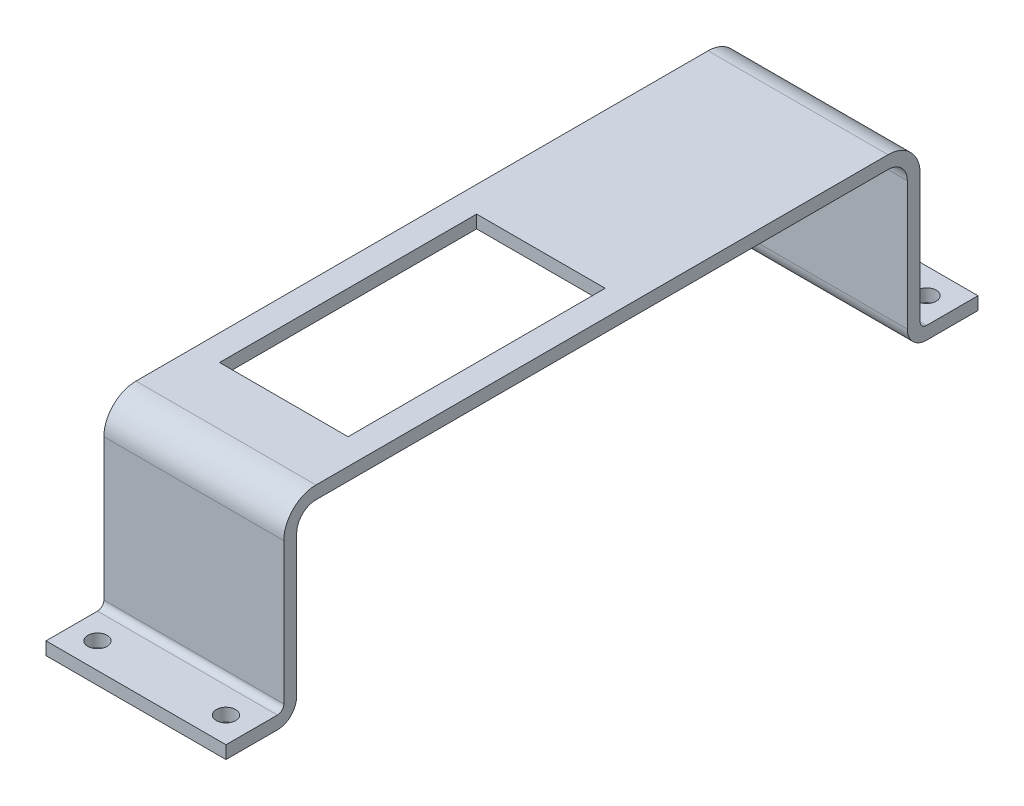
ISO-10303-21;
HEADER;
FILE_DESCRIPTION(('STEP AP214'),'2;1');
FILE_NAME('part.step','',(''),(''),'','','');
FILE_SCHEMA(('AUTOMOTIVE_DESIGN { 1 0 10303 214 1 1 1 1 }'));
ENDSEC;
DATA;
#1=APPLICATION_CONTEXT('core data for automotive mechanical design processes');
#2=APPLICATION_PROTOCOL_DEFINITION('international standard','automotive_design',2000,#1);
#3=PRODUCT_CONTEXT('',#1,'mechanical');
#4=PRODUCT('Part','Part','',(#3));
#5=PRODUCT_RELATED_PRODUCT_CATEGORY('part','',(#4));
#6=PRODUCT_DEFINITION_FORMATION('','',#4);
#7=PRODUCT_DEFINITION_CONTEXT('part definition',#1,'design');
#8=PRODUCT_DEFINITION('design','',#6,#7);
#9=PRODUCT_DEFINITION_SHAPE('','',#8);
#10=(LENGTH_UNIT() NAMED_UNIT(*) SI_UNIT(.MILLI.,.METRE.));
#11=(NAMED_UNIT(*) PLANE_ANGLE_UNIT() SI_UNIT($,.RADIAN.));
#12=(NAMED_UNIT(*) SI_UNIT($,.STERADIAN.) SOLID_ANGLE_UNIT());
#13=UNCERTAINTY_MEASURE_WITH_UNIT(LENGTH_MEASURE(1.E-05),#10,'distance_accuracy_value','');
#14=(GEOMETRIC_REPRESENTATION_CONTEXT(3) GLOBAL_UNCERTAINTY_ASSIGNED_CONTEXT((#13)) GLOBAL_UNIT_ASSIGNED_CONTEXT((#10,
#11,#12)) REPRESENTATION_CONTEXT('',''));
#15=CARTESIAN_POINT('',(0.,0.,0.));
#16=DIRECTION('',(0.,0.,1.));
#17=DIRECTION('',(1.,0.,0.));
#18=AXIS2_PLACEMENT_3D('',#15,#16,#17);
#19=CARTESIAN_POINT('',(14.,2.,-11.));
#20=DIRECTION('',(0.,0.,1.));
#21=DIRECTION('',(1.,0.,0.));
#22=AXIS2_PLACEMENT_3D('',#19,#20,#21);
#23=PLANE('',#22);
#24=DIRECTION('',(0.,1.,0.));
#25=VECTOR('',#24,1.);
#26=CARTESIAN_POINT('',(-14.,2.,-11.));
#27=LINE('',#26,#25);
#28=CARTESIAN_POINT('',(-14.,0.,-11.));
#29=VERTEX_POINT('',#28);
#30=CARTESIAN_POINT('',(-14.,2.,-11.));
#31=VERTEX_POINT('',#30);
#32=EDGE_CURVE('E220',#29,#31,#27,.T.);
#33=ORIENTED_EDGE('',*,*,#32,.T.);
#34=DIRECTION('',(-1.,0.,0.));
#35=VECTOR('',#34,1.);
#36=CARTESIAN_POINT('',(14.,2.,-11.));
#37=LINE('',#36,#35);
#38=CARTESIAN_POINT('',(14.,2.,-11.));
#39=VERTEX_POINT('',#38);
#40=EDGE_CURVE('E361',#39,#31,#37,.T.);
#41=ORIENTED_EDGE('',*,*,#40,.F.);
#42=DIRECTION('',(0.,1.,0.));
#43=VECTOR('',#42,1.);
#44=CARTESIAN_POINT('',(14.,2.,-11.));
#45=LINE('',#44,#43);
#46=CARTESIAN_POINT('',(14.,0.,-11.));
#47=VERTEX_POINT('',#46);
#48=EDGE_CURVE('E223',#47,#39,#45,.T.);
#49=ORIENTED_EDGE('',*,*,#48,.F.);
#50=DIRECTION('',(-1.,0.,0.));
#51=VECTOR('',#50,1.);
#52=CARTESIAN_POINT('',(14.,0.,-11.));
#53=LINE('',#52,#51);
#54=EDGE_CURVE('E265',#47,#29,#53,.T.);
#55=ORIENTED_EDGE('',*,*,#54,.T.);
#56=EDGE_LOOP('',(#33,#41,#49,#55));
#57=FACE_BOUND('',#56,.T.);
#58=ADVANCED_FACE('F32',(#57),#23,.F.);
#59=CARTESIAN_POINT('',(14.,2.,-3.));
#60=DIRECTION('',(0.,-1.,0.));
#61=DIRECTION('',(0.,0.,-1.));
#62=AXIS2_PLACEMENT_3D('',#59,#60,#61);
#63=PLANE('',#62);
#64=CARTESIAN_POINT('',(-10.,2.,-7.));
#65=DIRECTION('',(0.,1.,0.));
#66=DIRECTION('',(0.,0.,1.));
#67=AXIS2_PLACEMENT_3D('',#64,#65,#66);
#68=CIRCLE('',#67,1.5);
#69=CARTESIAN_POINT('',(-10.,2.,-5.5));
#70=VERTEX_POINT('',#69);
#71=EDGE_CURVE('E382',#70,#70,#68,.T.);
#72=ORIENTED_EDGE('',*,*,#71,.F.);
#73=EDGE_LOOP('',(#72));
#74=FACE_BOUND('',#73,.T.);
#75=CARTESIAN_POINT('',(10.,2.,-7.));
#76=DIRECTION('',(0.,1.,0.));
#77=DIRECTION('',(0.,0.,1.));
#78=AXIS2_PLACEMENT_3D('',#75,#76,#77);
#79=CIRCLE('',#78,1.5);
#80=CARTESIAN_POINT('',(10.,2.,-5.5));
#81=VERTEX_POINT('',#80);
#82=EDGE_CURVE('E371',#81,#81,#79,.T.);
#83=ORIENTED_EDGE('',*,*,#82,.F.);
#84=EDGE_LOOP('',(#83));
#85=FACE_BOUND('',#84,.T.);
#86=DIRECTION('',(0.,0.,1.));
#87=VECTOR('',#86,1.);
#88=CARTESIAN_POINT('',(-14.,2.,-3.));
#89=LINE('',#88,#87);
#90=CARTESIAN_POINT('',(-14.,2.,-3.));
#91=VERTEX_POINT('',#90);
#92=EDGE_CURVE('E268',#31,#91,#89,.T.);
#93=ORIENTED_EDGE('',*,*,#92,.T.);
#94=DIRECTION('',(-1.,0.,0.));
#95=VECTOR('',#94,1.);
#96=CARTESIAN_POINT('',(14.,2.,-3.));
#97=LINE('',#96,#95);
#98=CARTESIAN_POINT('',(14.,2.,-3.));
#99=VERTEX_POINT('',#98);
#100=EDGE_CURVE('E358',#99,#91,#97,.T.);
#101=ORIENTED_EDGE('',*,*,#100,.F.);
#102=DIRECTION('',(0.,0.,1.));
#103=VECTOR('',#102,1.);
#104=CARTESIAN_POINT('',(14.,2.,-3.));
#105=LINE('',#104,#103);
#106=EDGE_CURVE('E226',#39,#99,#105,.T.);
#107=ORIENTED_EDGE('',*,*,#106,.F.);
#108=ORIENTED_EDGE('',*,*,#40,.T.);
#109=EDGE_LOOP('',(#93,#101,#107,#108));
#110=FACE_BOUND('',#109,.T.);
#111=ADVANCED_FACE('F464',(#74,#85,#110),#63,.F.);
#112=CARTESIAN_POINT('',(14.,3.,-3.));
#113=DIRECTION('',(-1.,0.,0.));
#114=DIRECTION('',(0.,0.,1.));
#115=AXIS2_PLACEMENT_3D('',#112,#113,#114);
#116=CYLINDRICAL_SURFACE('',#115,1.);
#117=CARTESIAN_POINT('',(-14.,3.,-3.));
#118=DIRECTION('',(-1.,0.,0.));
#119=DIRECTION('',(0.,0.,-1.));
#120=AXIS2_PLACEMENT_3D('',#117,#118,#119);
#121=CIRCLE('',#120,1.);
#122=CARTESIAN_POINT('',(-14.,3.,-2.));
#123=VERTEX_POINT('',#122);
#124=EDGE_CURVE('E270',#91,#123,#121,.T.);
#125=ORIENTED_EDGE('',*,*,#124,.T.);
#126=DIRECTION('',(-1.,0.,0.));
#127=VECTOR('',#126,1.);
#128=CARTESIAN_POINT('',(14.,3.,-2.));
#129=LINE('',#128,#127);
#130=CARTESIAN_POINT('',(14.,3.,-2.));
#131=VERTEX_POINT('',#130);
#132=EDGE_CURVE('E355',#131,#123,#129,.T.);
#133=ORIENTED_EDGE('',*,*,#132,.F.);
#134=CARTESIAN_POINT('',(14.,3.,-3.));
#135=DIRECTION('',(-1.,0.,0.));
#136=DIRECTION('',(0.,0.,-1.));
#137=AXIS2_PLACEMENT_3D('',#134,#135,#136);
#138=CIRCLE('',#137,1.);
#139=EDGE_CURVE('E229',#99,#131,#138,.T.);
#140=ORIENTED_EDGE('',*,*,#139,.F.);
#141=ORIENTED_EDGE('',*,*,#100,.T.);
#142=EDGE_LOOP('',(#125,#133,#140,#141));
#143=FACE_BOUND('',#142,.T.);
#144=ADVANCED_FACE('F459',(#143),#116,.F.);
#145=CARTESIAN_POINT('',(14.,23.,-2.));
#146=DIRECTION('',(0.,0.,1.));
#147=DIRECTION('',(0.,-1.,0.));
#148=AXIS2_PLACEMENT_3D('',#145,#146,#147);
#149=PLANE('',#148);
#150=DIRECTION('',(0.,1.,0.));
#151=VECTOR('',#150,1.);
#152=CARTESIAN_POINT('',(-14.,23.,-2.));
#153=LINE('',#152,#151);
#154=CARTESIAN_POINT('',(-14.,23.,-2.));
#155=VERTEX_POINT('',#154);
#156=EDGE_CURVE('E272',#123,#155,#153,.T.);
#157=ORIENTED_EDGE('',*,*,#156,.T.);
#158=DIRECTION('',(-1.,0.,0.));
#159=VECTOR('',#158,1.);
#160=CARTESIAN_POINT('',(14.,23.,-2.));
#161=LINE('',#160,#159);
#162=CARTESIAN_POINT('',(14.,23.,-2.));
#163=VERTEX_POINT('',#162);
#164=EDGE_CURVE('E352',#163,#155,#161,.T.);
#165=ORIENTED_EDGE('',*,*,#164,.F.);
#166=DIRECTION('',(0.,1.,0.));
#167=VECTOR('',#166,1.);
#168=CARTESIAN_POINT('',(14.,23.,-2.));
#169=LINE('',#168,#167);
#170=EDGE_CURVE('E231',#131,#163,#169,.T.);
#171=ORIENTED_EDGE('',*,*,#170,.F.);
#172=ORIENTED_EDGE('',*,*,#132,.T.);
#173=EDGE_LOOP('',(#157,#165,#171,#172));
#174=FACE_BOUND('',#173,.T.);
#175=ADVANCED_FACE('F455',(#174),#149,.F.);
#176=CARTESIAN_POINT('',(14.,23.,3.));
#177=DIRECTION('',(-1.,0.,0.));
#178=DIRECTION('',(0.,0.,1.));
#179=AXIS2_PLACEMENT_3D('',#176,#177,#178);
#180=CYLINDRICAL_SURFACE('',#179,5.);
#181=CARTESIAN_POINT('',(-14.,23.,3.));
#182=DIRECTION('',(1.,0.,0.));
#183=DIRECTION('',(0.,0.,1.));
#184=AXIS2_PLACEMENT_3D('',#181,#182,#183);
#185=CIRCLE('',#184,5.);
#186=CARTESIAN_POINT('',(-14.,28.,3.));
#187=VERTEX_POINT('',#186);
#188=EDGE_CURVE('E274',#155,#187,#185,.T.);
#189=ORIENTED_EDGE('',*,*,#188,.T.);
#190=DIRECTION('',(-1.,0.,0.));
#191=VECTOR('',#190,1.);
#192=CARTESIAN_POINT('',(14.,28.,3.));
#193=LINE('',#192,#191);
#194=CARTESIAN_POINT('',(14.,28.,3.));
#195=VERTEX_POINT('',#194);
#196=EDGE_CURVE('E349',#195,#187,#193,.T.);
#197=ORIENTED_EDGE('',*,*,#196,.F.);
#198=CARTESIAN_POINT('',(14.,23.,3.));
#199=DIRECTION('',(1.,0.,0.));
#200=DIRECTION('',(0.,0.,1.));
#201=AXIS2_PLACEMENT_3D('',#198,#199,#200);
#202=CIRCLE('',#201,5.);
#203=EDGE_CURVE('E233',#163,#195,#202,.T.);
#204=ORIENTED_EDGE('',*,*,#203,.F.);
#205=ORIENTED_EDGE('',*,*,#164,.T.);
#206=EDGE_LOOP('',(#189,#197,#204,#205));
#207=FACE_BOUND('',#206,.T.);
#208=ADVANCED_FACE('F450',(#207),#180,.T.);
#209=CARTESIAN_POINT('',(14.,28.,3.));
#210=DIRECTION('',(0.,-1.,0.));
#211=DIRECTION('',(0.,0.,-1.));
#212=AXIS2_PLACEMENT_3D('',#209,#210,#211);
#213=PLANE('',#212);
#214=DIRECTION('',(1.,0.,0.));
#215=VECTOR('',#214,1.);
#216=CARTESIAN_POINT('',(-9.99999999999999,28.,83.));
#217=LINE('',#216,#215);
#218=CARTESIAN_POINT('',(-9.99999999999999,28.,83.));
#219=VERTEX_POINT('',#218);
#220=CARTESIAN_POINT('',(10.,28.,83.));
#221=VERTEX_POINT('',#220);
#222=EDGE_CURVE('E206',#219,#221,#217,.T.);
#223=ORIENTED_EDGE('',*,*,#222,.F.);
#224=DIRECTION('',(0.,0.,1.));
#225=VECTOR('',#224,1.);
#226=CARTESIAN_POINT('',(-9.99999999999999,28.,43.));
#227=LINE('',#226,#225);
#228=CARTESIAN_POINT('',(-9.99999999999999,28.,43.));
#229=VERTEX_POINT('',#228);
#230=EDGE_CURVE('E48',#229,#219,#227,.T.);
#231=ORIENTED_EDGE('',*,*,#230,.F.);
#232=DIRECTION('',(-1.,0.,0.));
#233=VECTOR('',#232,1.);
#234=CARTESIAN_POINT('',(-9.99999999999999,28.,43.));
#235=LINE('',#234,#233);
#236=CARTESIAN_POINT('',(10.,28.,43.));
#237=VERTEX_POINT('',#236);
#238=EDGE_CURVE('E213',#237,#229,#235,.T.);
#239=ORIENTED_EDGE('',*,*,#238,.F.);
#240=DIRECTION('',(0.,0.,-1.));
#241=VECTOR('',#240,1.);
#242=CARTESIAN_POINT('',(10.,28.,43.));
#243=LINE('',#242,#241);
#244=EDGE_CURVE('E197',#221,#237,#243,.T.);
#245=ORIENTED_EDGE('',*,*,#244,.F.);
#246=EDGE_LOOP('',(#223,#231,#239,#245));
#247=FACE_BOUND('',#246,.T.);
#248=DIRECTION('',(0.,0.,1.));
#249=VECTOR('',#248,1.);
#250=CARTESIAN_POINT('',(-14.,28.,3.));
#251=LINE('',#250,#249);
#252=CARTESIAN_POINT('',(-14.,28.,92.));
#253=VERTEX_POINT('',#252);
#254=EDGE_CURVE('E276',#187,#253,#251,.T.);
#255=ORIENTED_EDGE('',*,*,#254,.T.);
#256=DIRECTION('',(-1.,0.,0.));
#257=VECTOR('',#256,1.);
#258=CARTESIAN_POINT('',(14.,28.,92.));
#259=LINE('',#258,#257);
#260=CARTESIAN_POINT('',(14.,28.,92.));
#261=VERTEX_POINT('',#260);
#262=EDGE_CURVE('E346',#261,#253,#259,.T.);
#263=ORIENTED_EDGE('',*,*,#262,.F.);
#264=DIRECTION('',(0.,0.,1.));
#265=VECTOR('',#264,1.);
#266=CARTESIAN_POINT('',(14.,28.,3.));
#267=LINE('',#266,#265);
#268=EDGE_CURVE('E235',#195,#261,#267,.T.);
#269=ORIENTED_EDGE('',*,*,#268,.F.);
#270=ORIENTED_EDGE('',*,*,#196,.T.);
#271=EDGE_LOOP('',(#255,#263,#269,#270));
#272=FACE_BOUND('',#271,.T.);
#273=ADVANCED_FACE('F210',(#247,#272),#213,.F.);
#274=CARTESIAN_POINT('',(14.,23.,92.));
#275=DIRECTION('',(-1.,0.,0.));
#276=DIRECTION('',(0.,0.,1.));
#277=AXIS2_PLACEMENT_3D('',#274,#275,#276);
#278=CYLINDRICAL_SURFACE('',#277,5.);
#279=CARTESIAN_POINT('',(-14.,23.,92.));
#280=DIRECTION('',(1.,0.,0.));
#281=DIRECTION('',(0.,0.,-1.));
#282=AXIS2_PLACEMENT_3D('',#279,#280,#281);
#283=CIRCLE('',#282,5.);
#284=CARTESIAN_POINT('',(-14.,23.,97.));
#285=VERTEX_POINT('',#284);
#286=EDGE_CURVE('E278',#253,#285,#283,.T.);
#287=ORIENTED_EDGE('',*,*,#286,.T.);
#288=DIRECTION('',(-1.,0.,0.));
#289=VECTOR('',#288,1.);
#290=CARTESIAN_POINT('',(14.,23.,97.));
#291=LINE('',#290,#289);
#292=CARTESIAN_POINT('',(14.,23.,97.));
#293=VERTEX_POINT('',#292);
#294=EDGE_CURVE('E343',#293,#285,#291,.T.);
#295=ORIENTED_EDGE('',*,*,#294,.F.);
#296=CARTESIAN_POINT('',(14.,23.,92.));
#297=DIRECTION('',(1.,0.,0.));
#298=DIRECTION('',(0.,0.,-1.));
#299=AXIS2_PLACEMENT_3D('',#296,#297,#298);
#300=CIRCLE('',#299,5.);
#301=EDGE_CURVE('E237',#261,#293,#300,.T.);
#302=ORIENTED_EDGE('',*,*,#301,.F.);
#303=ORIENTED_EDGE('',*,*,#262,.T.);
#304=EDGE_LOOP('',(#287,#295,#302,#303));
#305=FACE_BOUND('',#304,.T.);
#306=ADVANCED_FACE('F442',(#305),#278,.T.);
#307=CARTESIAN_POINT('',(14.,23.,97.));
#308=DIRECTION('',(0.,0.,-1.));
#309=DIRECTION('',(-1.,0.,0.));
#310=AXIS2_PLACEMENT_3D('',#307,#308,#309);
#311=PLANE('',#310);
#312=DIRECTION('',(0.,-1.,0.));
#313=VECTOR('',#312,1.);
#314=CARTESIAN_POINT('',(-14.,23.,97.));
#315=LINE('',#314,#313);
#316=CARTESIAN_POINT('',(-14.,0.999999999999994,97.));
#317=VERTEX_POINT('',#316);
#318=EDGE_CURVE('E280',#285,#317,#315,.T.);
#319=ORIENTED_EDGE('',*,*,#318,.T.);
#320=DIRECTION('',(-1.,0.,0.));
#321=VECTOR('',#320,1.);
#322=CARTESIAN_POINT('',(14.,0.999999999999994,97.));
#323=LINE('',#322,#321);
#324=CARTESIAN_POINT('',(14.,0.999999999999994,97.));
#325=VERTEX_POINT('',#324);
#326=EDGE_CURVE('E340',#325,#317,#323,.T.);
#327=ORIENTED_EDGE('',*,*,#326,.F.);
#328=DIRECTION('',(0.,-1.,0.));
#329=VECTOR('',#328,1.);
#330=CARTESIAN_POINT('',(14.,23.,97.));
#331=LINE('',#330,#329);
#332=EDGE_CURVE('E239',#293,#325,#331,.T.);
#333=ORIENTED_EDGE('',*,*,#332,.F.);
#334=ORIENTED_EDGE('',*,*,#294,.T.);
#335=EDGE_LOOP('',(#319,#327,#333,#334));
#336=FACE_BOUND('',#335,.T.);
#337=ADVANCED_FACE('F438',(#336),#311,.F.);
#338=CARTESIAN_POINT('',(14.,0.999999999999995,98.));
#339=DIRECTION('',(-1.,0.,0.));
#340=DIRECTION('',(0.,0.,1.));
#341=AXIS2_PLACEMENT_3D('',#338,#339,#340);
#342=CYLINDRICAL_SURFACE('',#341,1.);
#343=CARTESIAN_POINT('',(-14.,0.999999999999995,98.));
#344=DIRECTION('',(-1.,0.,0.));
#345=DIRECTION('',(0.,0.,1.));
#346=AXIS2_PLACEMENT_3D('',#343,#344,#345);
#347=CIRCLE('',#346,1.);
#348=CARTESIAN_POINT('',(-14.,0.,98.));
#349=VERTEX_POINT('',#348);
#350=EDGE_CURVE('E282',#317,#349,#347,.T.);
#351=ORIENTED_EDGE('',*,*,#350,.T.);
#352=DIRECTION('',(-1.,0.,0.));
#353=VECTOR('',#352,1.);
#354=CARTESIAN_POINT('',(14.,0.,98.));
#355=LINE('',#354,#353);
#356=CARTESIAN_POINT('',(14.,0.,98.));
#357=VERTEX_POINT('',#356);
#358=EDGE_CURVE('E337',#357,#349,#355,.T.);
#359=ORIENTED_EDGE('',*,*,#358,.F.);
#360=CARTESIAN_POINT('',(14.,0.999999999999995,98.));
#361=DIRECTION('',(-1.,0.,0.));
#362=DIRECTION('',(0.,0.,1.));
#363=AXIS2_PLACEMENT_3D('',#360,#361,#362);
#364=CIRCLE('',#363,1.);
#365=EDGE_CURVE('E241',#325,#357,#364,.T.);
#366=ORIENTED_EDGE('',*,*,#365,.F.);
#367=ORIENTED_EDGE('',*,*,#326,.T.);
#368=EDGE_LOOP('',(#351,#359,#366,#367));
#369=FACE_BOUND('',#368,.T.);
#370=ADVANCED_FACE('F400',(#369),#342,.F.);
#371=CARTESIAN_POINT('',(14.,0.,98.));
#372=DIRECTION('',(0.,-1.,0.));
#373=DIRECTION('',(0.,0.,-1.));
#374=AXIS2_PLACEMENT_3D('',#371,#372,#373);
#375=PLANE('',#374);
#376=CARTESIAN_POINT('',(-10.,0.,102.));
#377=DIRECTION('',(0.,1.,0.));
#378=DIRECTION('',(0.,0.,1.));
#379=AXIS2_PLACEMENT_3D('',#376,#377,#378);
#380=CIRCLE('',#379,1.5);
#381=CARTESIAN_POINT('',(-10.,0.,103.5));
#382=VERTEX_POINT('',#381);
#383=EDGE_CURVE('E370',#382,#382,#380,.T.);
#384=ORIENTED_EDGE('',*,*,#383,.F.);
#385=EDGE_LOOP('',(#384));
#386=FACE_BOUND('',#385,.T.);
#387=CARTESIAN_POINT('',(10.,0.,102.));
#388=DIRECTION('',(0.,1.,0.));
#389=DIRECTION('',(0.,0.,1.));
#390=AXIS2_PLACEMENT_3D('',#387,#388,#389);
#391=CIRCLE('',#390,1.5);
#392=CARTESIAN_POINT('',(10.,0.,103.5));
#393=VERTEX_POINT('',#392);
#394=EDGE_CURVE('E386',#393,#393,#391,.T.);
#395=ORIENTED_EDGE('',*,*,#394,.F.);
#396=EDGE_LOOP('',(#395));
#397=FACE_BOUND('',#396,.T.);
#398=DIRECTION('',(0.,0.,1.));
#399=VECTOR('',#398,1.);
#400=CARTESIAN_POINT('',(-14.,0.,98.));
#401=LINE('',#400,#399);
#402=CARTESIAN_POINT('',(-14.,0.,106.));
#403=VERTEX_POINT('',#402);
#404=EDGE_CURVE('E284',#349,#403,#401,.T.);
#405=ORIENTED_EDGE('',*,*,#404,.T.);
#406=DIRECTION('',(-1.,0.,0.));
#407=VECTOR('',#406,1.);
#408=CARTESIAN_POINT('',(14.,0.,106.));
#409=LINE('',#408,#407);
#410=CARTESIAN_POINT('',(14.,0.,106.));
#411=VERTEX_POINT('',#410);
#412=EDGE_CURVE('E334',#411,#403,#409,.T.);
#413=ORIENTED_EDGE('',*,*,#412,.F.);
#414=DIRECTION('',(0.,0.,1.));
#415=VECTOR('',#414,1.);
#416=CARTESIAN_POINT('',(14.,0.,98.));
#417=LINE('',#416,#415);
#418=EDGE_CURVE('E243',#357,#411,#417,.T.);
#419=ORIENTED_EDGE('',*,*,#418,.F.);
#420=ORIENTED_EDGE('',*,*,#358,.T.);
#421=EDGE_LOOP('',(#405,#413,#419,#420));
#422=FACE_BOUND('',#421,.T.);
#423=ADVANCED_FACE('F396',(#386,#397,#422),#375,.F.);
#424=CARTESIAN_POINT('',(14.,0.,106.));
#425=DIRECTION('',(0.,0.,-1.));
#426=DIRECTION('',(-1.,0.,0.));
#427=AXIS2_PLACEMENT_3D('',#424,#425,#426);
#428=PLANE('',#427);
#429=DIRECTION('',(0.,-1.,0.));
#430=VECTOR('',#429,1.);
#431=CARTESIAN_POINT('',(-14.,0.,106.));
#432=LINE('',#431,#430);
#433=CARTESIAN_POINT('',(-14.,-2.00000000000001,106.));
#434=VERTEX_POINT('',#433);
#435=EDGE_CURVE('E286',#403,#434,#432,.T.);
#436=ORIENTED_EDGE('',*,*,#435,.T.);
#437=DIRECTION('',(-1.,0.,0.));
#438=VECTOR('',#437,1.);
#439=CARTESIAN_POINT('',(14.,-2.00000000000001,106.));
#440=LINE('',#439,#438);
#441=CARTESIAN_POINT('',(14.,-2.00000000000001,106.));
#442=VERTEX_POINT('',#441);
#443=EDGE_CURVE('E331',#442,#434,#440,.T.);
#444=ORIENTED_EDGE('',*,*,#443,.F.);
#445=DIRECTION('',(0.,-1.,0.));
#446=VECTOR('',#445,1.);
#447=CARTESIAN_POINT('',(14.,0.,106.));
#448=LINE('',#447,#446);
#449=EDGE_CURVE('E245',#411,#442,#448,.T.);
#450=ORIENTED_EDGE('',*,*,#449,.F.);
#451=ORIENTED_EDGE('',*,*,#412,.T.);
#452=EDGE_LOOP('',(#436,#444,#450,#451));
#453=FACE_BOUND('',#452,.T.);
#454=ADVANCED_FACE('F399',(#453),#428,.F.);
#455=CARTESIAN_POINT('',(14.,-2.00000000000001,98.));
#456=DIRECTION('',(0.,1.,0.));
#457=DIRECTION('',(0.,0.,1.));
#458=AXIS2_PLACEMENT_3D('',#455,#456,#457);
#459=PLANE('',#458);
#460=CARTESIAN_POINT('',(-10.,-2.00000000000002,102.));
#461=DIRECTION('',(0.,1.,0.));
#462=DIRECTION('',(0.,0.,1.));
#463=AXIS2_PLACEMENT_3D('',#460,#461,#462);
#464=CIRCLE('',#463,1.5);
#465=CARTESIAN_POINT('',(-10.,-2.00000000000002,103.5));
#466=VERTEX_POINT('',#465);
#467=EDGE_CURVE('E375',#466,#466,#464,.T.);
#468=ORIENTED_EDGE('',*,*,#467,.T.);
#469=EDGE_LOOP('',(#468));
#470=FACE_BOUND('',#469,.T.);
#471=CARTESIAN_POINT('',(10.,-2.00000000000002,102.));
#472=DIRECTION('',(0.,1.,0.));
#473=DIRECTION('',(0.,0.,1.));
#474=AXIS2_PLACEMENT_3D('',#471,#472,#473);
#475=CIRCLE('',#474,1.5);
#476=CARTESIAN_POINT('',(10.,-2.00000000000002,103.5));
#477=VERTEX_POINT('',#476);
#478=EDGE_CURVE('E388',#477,#477,#475,.T.);
#479=ORIENTED_EDGE('',*,*,#478,.T.);
#480=EDGE_LOOP('',(#479));
#481=FACE_BOUND('',#480,.T.);
#482=DIRECTION('',(0.,0.,-1.));
#483=VECTOR('',#482,1.);
#484=CARTESIAN_POINT('',(-14.,-2.00000000000001,98.));
#485=LINE('',#484,#483);
#486=CARTESIAN_POINT('',(-14.,-2.00000000000001,98.));
#487=VERTEX_POINT('',#486);
#488=EDGE_CURVE('E288',#434,#487,#485,.T.);
#489=ORIENTED_EDGE('',*,*,#488,.T.);
#490=DIRECTION('',(-1.,0.,0.));
#491=VECTOR('',#490,1.);
#492=CARTESIAN_POINT('',(14.,-2.00000000000001,98.));
#493=LINE('',#492,#491);
#494=CARTESIAN_POINT('',(14.,-2.00000000000001,98.));
#495=VERTEX_POINT('',#494);
#496=EDGE_CURVE('E328',#495,#487,#493,.T.);
#497=ORIENTED_EDGE('',*,*,#496,.F.);
#498=DIRECTION('',(0.,0.,-1.));
#499=VECTOR('',#498,1.);
#500=CARTESIAN_POINT('',(14.,-2.00000000000001,98.));
#501=LINE('',#500,#499);
#502=EDGE_CURVE('E247',#442,#495,#501,.T.);
#503=ORIENTED_EDGE('',*,*,#502,.F.);
#504=ORIENTED_EDGE('',*,*,#443,.T.);
#505=EDGE_LOOP('',(#489,#497,#503,#504));
#506=FACE_BOUND('',#505,.T.);
#507=ADVANCED_FACE('F420',(#470,#481,#506),#459,.F.);
#508=CARTESIAN_POINT('',(14.,0.999999999999995,98.));
#509=DIRECTION('',(-1.,0.,0.));
#510=DIRECTION('',(0.,0.,1.));
#511=AXIS2_PLACEMENT_3D('',#508,#509,#510);
#512=CYLINDRICAL_SURFACE('',#511,3.);
#513=CARTESIAN_POINT('',(-14.,0.999999999999995,98.));
#514=DIRECTION('',(1.,0.,0.));
#515=DIRECTION('',(0.,0.,1.));
#516=AXIS2_PLACEMENT_3D('',#513,#514,#515);
#517=CIRCLE('',#516,3.);
#518=CARTESIAN_POINT('',(-14.,0.999999999999995,95.));
#519=VERTEX_POINT('',#518);
#520=EDGE_CURVE('E290',#487,#519,#517,.T.);
#521=ORIENTED_EDGE('',*,*,#520,.T.);
#522=DIRECTION('',(-1.,0.,0.));
#523=VECTOR('',#522,1.);
#524=CARTESIAN_POINT('',(14.,0.999999999999995,95.));
#525=LINE('',#524,#523);
#526=CARTESIAN_POINT('',(14.,0.999999999999995,95.));
#527=VERTEX_POINT('',#526);
#528=EDGE_CURVE('E325',#527,#519,#525,.T.);
#529=ORIENTED_EDGE('',*,*,#528,.F.);
#530=CARTESIAN_POINT('',(14.,0.999999999999995,98.));
#531=DIRECTION('',(1.,0.,0.));
#532=DIRECTION('',(0.,0.,1.));
#533=AXIS2_PLACEMENT_3D('',#530,#531,#532);
#534=CIRCLE('',#533,3.);
#535=EDGE_CURVE('E249',#495,#527,#534,.T.);
#536=ORIENTED_EDGE('',*,*,#535,.F.);
#537=ORIENTED_EDGE('',*,*,#496,.T.);
#538=EDGE_LOOP('',(#521,#529,#536,#537));
#539=FACE_BOUND('',#538,.T.);
#540=ADVANCED_FACE('F424',(#539),#512,.T.);
#541=CARTESIAN_POINT('',(14.,23.,95.));
#542=DIRECTION('',(0.,0.,1.));
#543=DIRECTION('',(1.,0.,0.));
#544=AXIS2_PLACEMENT_3D('',#541,#542,#543);
#545=PLANE('',#544);
#546=DIRECTION('',(0.,1.,0.));
#547=VECTOR('',#546,1.);
#548=CARTESIAN_POINT('',(-14.,23.,95.));
#549=LINE('',#548,#547);
#550=CARTESIAN_POINT('',(-14.,23.,95.));
#551=VERTEX_POINT('',#550);
#552=EDGE_CURVE('E292',#519,#551,#549,.T.);
#553=ORIENTED_EDGE('',*,*,#552,.T.);
#554=DIRECTION('',(-1.,0.,0.));
#555=VECTOR('',#554,1.);
#556=CARTESIAN_POINT('',(14.,23.,95.));
#557=LINE('',#556,#555);
#558=CARTESIAN_POINT('',(14.,23.,95.));
#559=VERTEX_POINT('',#558);
#560=EDGE_CURVE('E322',#559,#551,#557,.T.);
#561=ORIENTED_EDGE('',*,*,#560,.F.);
#562=DIRECTION('',(0.,1.,0.));
#563=VECTOR('',#562,1.);
#564=CARTESIAN_POINT('',(14.,23.,95.));
#565=LINE('',#564,#563);
#566=EDGE_CURVE('E251',#527,#559,#565,.T.);
#567=ORIENTED_EDGE('',*,*,#566,.F.);
#568=ORIENTED_EDGE('',*,*,#528,.T.);
#569=EDGE_LOOP('',(#553,#561,#567,#568));
#570=FACE_BOUND('',#569,.T.);
#571=ADVANCED_FACE('F497',(#570),#545,.F.);
#572=CARTESIAN_POINT('',(14.,23.,92.));
#573=DIRECTION('',(-1.,0.,0.));
#574=DIRECTION('',(0.,0.,1.));
#575=AXIS2_PLACEMENT_3D('',#572,#573,#574);
#576=CYLINDRICAL_SURFACE('',#575,3.);
#577=CARTESIAN_POINT('',(-14.,23.,92.));
#578=DIRECTION('',(-1.,0.,0.));
#579=DIRECTION('',(0.,0.,-1.));
#580=AXIS2_PLACEMENT_3D('',#577,#578,#579);
#581=CIRCLE('',#580,3.);
#582=CARTESIAN_POINT('',(-14.,26.,92.));
#583=VERTEX_POINT('',#582);
#584=EDGE_CURVE('E294',#551,#583,#581,.T.);
#585=ORIENTED_EDGE('',*,*,#584,.T.);
#586=DIRECTION('',(-1.,0.,0.));
#587=VECTOR('',#586,1.);
#588=CARTESIAN_POINT('',(14.,26.,92.));
#589=LINE('',#588,#587);
#590=CARTESIAN_POINT('',(14.,26.,92.));
#591=VERTEX_POINT('',#590);
#592=EDGE_CURVE('E319',#591,#583,#589,.T.);
#593=ORIENTED_EDGE('',*,*,#592,.F.);
#594=CARTESIAN_POINT('',(14.,23.,92.));
#595=DIRECTION('',(-1.,0.,0.));
#596=DIRECTION('',(0.,0.,-1.));
#597=AXIS2_PLACEMENT_3D('',#594,#595,#596);
#598=CIRCLE('',#597,3.);
#599=EDGE_CURVE('E253',#559,#591,#598,.T.);
#600=ORIENTED_EDGE('',*,*,#599,.F.);
#601=ORIENTED_EDGE('',*,*,#560,.T.);
#602=EDGE_LOOP('',(#585,#593,#600,#601));
#603=FACE_BOUND('',#602,.T.);
#604=ADVANCED_FACE('F495',(#603),#576,.F.);
#605=CARTESIAN_POINT('',(14.,26.,3.));
#606=DIRECTION('',(0.,1.,0.));
#607=DIRECTION('',(0.,0.,1.));
#608=AXIS2_PLACEMENT_3D('',#605,#606,#607);
#609=PLANE('',#608);
#610=DIRECTION('',(-1.,0.,0.));
#611=VECTOR('',#610,1.);
#612=CARTESIAN_POINT('',(14.,26.,43.));
#613=LINE('',#612,#611);
#614=CARTESIAN_POINT('',(10.,26.,43.));
#615=VERTEX_POINT('',#614);
#616=CARTESIAN_POINT('',(-9.99999999999999,26.,43.));
#617=VERTEX_POINT('',#616);
#618=EDGE_CURVE('E40',#615,#617,#613,.T.);
#619=ORIENTED_EDGE('',*,*,#618,.T.);
#620=DIRECTION('',(0.,0.,1.));
#621=VECTOR('',#620,1.);
#622=CARTESIAN_POINT('',(-10.,26.,3.));
#623=LINE('',#622,#621);
#624=CARTESIAN_POINT('',(-9.99999999999999,26.,83.));
#625=VERTEX_POINT('',#624);
#626=EDGE_CURVE('E11',#617,#625,#623,.T.);
#627=ORIENTED_EDGE('',*,*,#626,.T.);
#628=DIRECTION('',(1.,0.,0.));
#629=VECTOR('',#628,1.);
#630=CARTESIAN_POINT('',(14.,26.,83.));
#631=LINE('',#630,#629);
#632=CARTESIAN_POINT('',(10.,26.,83.));
#633=VERTEX_POINT('',#632);
#634=EDGE_CURVE('E364',#625,#633,#631,.T.);
#635=ORIENTED_EDGE('',*,*,#634,.T.);
#636=DIRECTION('',(0.,0.,-1.));
#637=VECTOR('',#636,1.);
#638=CARTESIAN_POINT('',(10.,26.,3.));
#639=LINE('',#638,#637);
#640=EDGE_CURVE('E200',#633,#615,#639,.T.);
#641=ORIENTED_EDGE('',*,*,#640,.T.);
#642=EDGE_LOOP('',(#619,#627,#635,#641));
#643=FACE_BOUND('',#642,.T.);
#644=DIRECTION('',(0.,0.,-1.));
#645=VECTOR('',#644,1.);
#646=CARTESIAN_POINT('',(-14.,26.,3.));
#647=LINE('',#646,#645);
#648=CARTESIAN_POINT('',(-14.,26.,3.));
#649=VERTEX_POINT('',#648);
#650=EDGE_CURVE('E296',#583,#649,#647,.T.);
#651=ORIENTED_EDGE('',*,*,#650,.T.);
#652=DIRECTION('',(-1.,0.,0.));
#653=VECTOR('',#652,1.);
#654=CARTESIAN_POINT('',(14.,26.,3.));
#655=LINE('',#654,#653);
#656=CARTESIAN_POINT('',(14.,26.,3.));
#657=VERTEX_POINT('',#656);
#658=EDGE_CURVE('E316',#657,#649,#655,.T.);
#659=ORIENTED_EDGE('',*,*,#658,.F.);
#660=DIRECTION('',(0.,0.,-1.));
#661=VECTOR('',#660,1.);
#662=CARTESIAN_POINT('',(14.,26.,3.));
#663=LINE('',#662,#661);
#664=EDGE_CURVE('E255',#591,#657,#663,.T.);
#665=ORIENTED_EDGE('',*,*,#664,.F.);
#666=ORIENTED_EDGE('',*,*,#592,.T.);
#667=EDGE_LOOP('',(#651,#659,#665,#666));
#668=FACE_BOUND('',#667,.T.);
#669=ADVANCED_FACE('F490',(#643,#668),#609,.F.);
#670=CARTESIAN_POINT('',(14.,23.,3.));
#671=DIRECTION('',(-1.,0.,0.));
#672=DIRECTION('',(0.,0.,1.));
#673=AXIS2_PLACEMENT_3D('',#670,#671,#672);
#674=CYLINDRICAL_SURFACE('',#673,3.);
#675=CARTESIAN_POINT('',(-14.,23.,3.));
#676=DIRECTION('',(-1.,0.,0.));
#677=DIRECTION('',(0.,0.,1.));
#678=AXIS2_PLACEMENT_3D('',#675,#676,#677);
#679=CIRCLE('',#678,3.);
#680=CARTESIAN_POINT('',(-14.,23.,0.));
#681=VERTEX_POINT('',#680);
#682=EDGE_CURVE('E298',#649,#681,#679,.T.);
#683=ORIENTED_EDGE('',*,*,#682,.T.);
#684=DIRECTION('',(-1.,0.,0.));
#685=VECTOR('',#684,1.);
#686=CARTESIAN_POINT('',(14.,23.,0.));
#687=LINE('',#686,#685);
#688=CARTESIAN_POINT('',(14.,23.,0.));
#689=VERTEX_POINT('',#688);
#690=EDGE_CURVE('E313',#689,#681,#687,.T.);
#691=ORIENTED_EDGE('',*,*,#690,.F.);
#692=CARTESIAN_POINT('',(14.,23.,3.));
#693=DIRECTION('',(-1.,0.,0.));
#694=DIRECTION('',(0.,0.,1.));
#695=AXIS2_PLACEMENT_3D('',#692,#693,#694);
#696=CIRCLE('',#695,3.);
#697=EDGE_CURVE('E257',#657,#689,#696,.T.);
#698=ORIENTED_EDGE('',*,*,#697,.F.);
#699=ORIENTED_EDGE('',*,*,#658,.T.);
#700=EDGE_LOOP('',(#683,#691,#698,#699));
#701=FACE_BOUND('',#700,.T.);
#702=ADVANCED_FACE('F485',(#701),#674,.F.);
#703=CARTESIAN_POINT('',(14.,23.,0.));
#704=DIRECTION('',(0.,0.,-1.));
#705=DIRECTION('',(0.,1.,0.));
#706=AXIS2_PLACEMENT_3D('',#703,#704,#705);
#707=PLANE('',#706);
#708=DIRECTION('',(0.,-1.,0.));
#709=VECTOR('',#708,1.);
#710=CARTESIAN_POINT('',(-14.,23.,0.));
#711=LINE('',#710,#709);
#712=CARTESIAN_POINT('',(-14.,3.,0.));
#713=VERTEX_POINT('',#712);
#714=EDGE_CURVE('E300',#681,#713,#711,.T.);
#715=ORIENTED_EDGE('',*,*,#714,.T.);
#716=DIRECTION('',(-1.,0.,0.));
#717=VECTOR('',#716,1.);
#718=CARTESIAN_POINT('',(14.,3.,0.));
#719=LINE('',#718,#717);
#720=CARTESIAN_POINT('',(14.,3.,0.));
#721=VERTEX_POINT('',#720);
#722=EDGE_CURVE('E310',#721,#713,#719,.T.);
#723=ORIENTED_EDGE('',*,*,#722,.F.);
#724=DIRECTION('',(0.,-1.,0.));
#725=VECTOR('',#724,1.);
#726=CARTESIAN_POINT('',(14.,23.,0.));
#727=LINE('',#726,#725);
#728=EDGE_CURVE('E259',#689,#721,#727,.T.);
#729=ORIENTED_EDGE('',*,*,#728,.F.);
#730=ORIENTED_EDGE('',*,*,#690,.T.);
#731=EDGE_LOOP('',(#715,#723,#729,#730));
#732=FACE_BOUND('',#731,.T.);
#733=ADVANCED_FACE('F481',(#732),#707,.F.);
#734=CARTESIAN_POINT('',(14.,3.,-3.));
#735=DIRECTION('',(-1.,0.,0.));
#736=DIRECTION('',(0.,0.,1.));
#737=AXIS2_PLACEMENT_3D('',#734,#735,#736);
#738=CYLINDRICAL_SURFACE('',#737,3.);
#739=CARTESIAN_POINT('',(-14.,3.,-3.));
#740=DIRECTION('',(1.,0.,0.));
#741=DIRECTION('',(0.,0.,-1.));
#742=AXIS2_PLACEMENT_3D('',#739,#740,#741);
#743=CIRCLE('',#742,3.);
#744=CARTESIAN_POINT('',(-14.,0.,-3.));
#745=VERTEX_POINT('',#744);
#746=EDGE_CURVE('E302',#713,#745,#743,.T.);
#747=ORIENTED_EDGE('',*,*,#746,.T.);
#748=DIRECTION('',(-1.,0.,0.));
#749=VECTOR('',#748,1.);
#750=CARTESIAN_POINT('',(14.,0.,-3.));
#751=LINE('',#750,#749);
#752=CARTESIAN_POINT('',(14.,0.,-3.));
#753=VERTEX_POINT('',#752);
#754=EDGE_CURVE('E307',#753,#745,#751,.T.);
#755=ORIENTED_EDGE('',*,*,#754,.F.);
#756=CARTESIAN_POINT('',(14.,3.,-3.));
#757=DIRECTION('',(1.,0.,0.));
#758=DIRECTION('',(0.,0.,-1.));
#759=AXIS2_PLACEMENT_3D('',#756,#757,#758);
#760=CIRCLE('',#759,3.);
#761=EDGE_CURVE('E261',#721,#753,#760,.T.);
#762=ORIENTED_EDGE('',*,*,#761,.F.);
#763=ORIENTED_EDGE('',*,*,#722,.T.);
#764=EDGE_LOOP('',(#747,#755,#762,#763));
#765=FACE_BOUND('',#764,.T.);
#766=ADVANCED_FACE('F476',(#765),#738,.T.);
#767=CARTESIAN_POINT('',(14.,0.,-3.));
#768=DIRECTION('',(0.,1.,0.));
#769=DIRECTION('',(0.,0.,1.));
#770=AXIS2_PLACEMENT_3D('',#767,#768,#769);
#771=PLANE('',#770);
#772=CARTESIAN_POINT('',(-10.,0.,-7.));
#773=DIRECTION('',(0.,1.,0.));
#774=DIRECTION('',(0.,0.,1.));
#775=AXIS2_PLACEMENT_3D('',#772,#773,#774);
#776=CIRCLE('',#775,1.5);
#777=CARTESIAN_POINT('',(-10.,0.,-5.5));
#778=VERTEX_POINT('',#777);
#779=EDGE_CURVE('E35',#778,#778,#776,.T.);
#780=ORIENTED_EDGE('',*,*,#779,.T.);
#781=EDGE_LOOP('',(#780));
#782=FACE_BOUND('',#781,.T.);
#783=CARTESIAN_POINT('',(10.,0.,-7.));
#784=DIRECTION('',(0.,1.,0.));
#785=DIRECTION('',(0.,0.,1.));
#786=AXIS2_PLACEMENT_3D('',#783,#784,#785);
#787=CIRCLE('',#786,1.5);
#788=CARTESIAN_POINT('',(10.,0.,-5.5));
#789=VERTEX_POINT('',#788);
#790=EDGE_CURVE('E368',#789,#789,#787,.T.);
#791=ORIENTED_EDGE('',*,*,#790,.T.);
#792=EDGE_LOOP('',(#791));
#793=FACE_BOUND('',#792,.T.);
#794=DIRECTION('',(0.,0.,-1.));
#795=VECTOR('',#794,1.);
#796=CARTESIAN_POINT('',(-14.,0.,-3.));
#797=LINE('',#796,#795);
#798=EDGE_CURVE('E227',#745,#29,#797,.T.);
#799=ORIENTED_EDGE('',*,*,#798,.T.);
#800=ORIENTED_EDGE('',*,*,#54,.F.);
#801=DIRECTION('',(0.,0.,-1.));
#802=VECTOR('',#801,1.);
#803=CARTESIAN_POINT('',(14.,0.,-3.));
#804=LINE('',#803,#802);
#805=EDGE_CURVE('E263',#753,#47,#804,.T.);
#806=ORIENTED_EDGE('',*,*,#805,.F.);
#807=ORIENTED_EDGE('',*,*,#754,.T.);
#808=EDGE_LOOP('',(#799,#800,#806,#807));
#809=FACE_BOUND('',#808,.T.);
#810=ADVANCED_FACE('F470',(#782,#793,#809),#771,.F.);
#811=CARTESIAN_POINT('',(14.,3.,-3.));
#812=DIRECTION('',(1.,0.,0.));
#813=DIRECTION('',(0.,0.,-1.));
#814=AXIS2_PLACEMENT_3D('',#811,#812,#813);
#815=PLANE('',#814);
#816=ORIENTED_EDGE('',*,*,#48,.T.);
#817=ORIENTED_EDGE('',*,*,#106,.T.);
#818=ORIENTED_EDGE('',*,*,#139,.T.);
#819=ORIENTED_EDGE('',*,*,#170,.T.);
#820=ORIENTED_EDGE('',*,*,#203,.T.);
#821=ORIENTED_EDGE('',*,*,#268,.T.);
#822=ORIENTED_EDGE('',*,*,#301,.T.);
#823=ORIENTED_EDGE('',*,*,#332,.T.);
#824=ORIENTED_EDGE('',*,*,#365,.T.);
#825=ORIENTED_EDGE('',*,*,#418,.T.);
#826=ORIENTED_EDGE('',*,*,#449,.T.);
#827=ORIENTED_EDGE('',*,*,#502,.T.);
#828=ORIENTED_EDGE('',*,*,#535,.T.);
#829=ORIENTED_EDGE('',*,*,#566,.T.);
#830=ORIENTED_EDGE('',*,*,#599,.T.);
#831=ORIENTED_EDGE('',*,*,#664,.T.);
#832=ORIENTED_EDGE('',*,*,#697,.T.);
#833=ORIENTED_EDGE('',*,*,#728,.T.);
#834=ORIENTED_EDGE('',*,*,#761,.T.);
#835=ORIENTED_EDGE('',*,*,#805,.T.);
#836=EDGE_LOOP('',(#816,#817,#818,#819,#820,#821,#822,#823,#824,#825,#826,#827,#828,#829,#830,
#831,#832,#833,#834,#835));
#837=FACE_BOUND('',#836,.T.);
#838=ADVANCED_FACE('F428',(#837),#815,.T.);
#839=CARTESIAN_POINT('',(-14.,3.,-3.));
#840=DIRECTION('',(1.,0.,0.));
#841=DIRECTION('',(0.,0.,-1.));
#842=AXIS2_PLACEMENT_3D('',#839,#840,#841);
#843=PLANE('',#842);
#844=ORIENTED_EDGE('',*,*,#32,.F.);
#845=ORIENTED_EDGE('',*,*,#798,.F.);
#846=ORIENTED_EDGE('',*,*,#746,.F.);
#847=ORIENTED_EDGE('',*,*,#714,.F.);
#848=ORIENTED_EDGE('',*,*,#682,.F.);
#849=ORIENTED_EDGE('',*,*,#650,.F.);
#850=ORIENTED_EDGE('',*,*,#584,.F.);
#851=ORIENTED_EDGE('',*,*,#552,.F.);
#852=ORIENTED_EDGE('',*,*,#520,.F.);
#853=ORIENTED_EDGE('',*,*,#488,.F.);
#854=ORIENTED_EDGE('',*,*,#435,.F.);
#855=ORIENTED_EDGE('',*,*,#404,.F.);
#856=ORIENTED_EDGE('',*,*,#350,.F.);
#857=ORIENTED_EDGE('',*,*,#318,.F.);
#858=ORIENTED_EDGE('',*,*,#286,.F.);
#859=ORIENTED_EDGE('',*,*,#254,.F.);
#860=ORIENTED_EDGE('',*,*,#188,.F.);
#861=ORIENTED_EDGE('',*,*,#156,.F.);
#862=ORIENTED_EDGE('',*,*,#124,.F.);
#863=ORIENTED_EDGE('',*,*,#92,.F.);
#864=EDGE_LOOP('',(#844,#845,#846,#847,#848,#849,#850,#851,#852,#853,#854,#855,#856,#857,#858,
#859,#860,#861,#862,#863));
#865=FACE_BOUND('',#864,.T.);
#866=ADVANCED_FACE('F415',(#865),#843,.F.);
#867=CARTESIAN_POINT('',(-9.99999999999999,-2.00000000000001,43.));
#868=DIRECTION('',(-1.,0.,0.));
#869=DIRECTION('',(0.,0.,1.));
#870=AXIS2_PLACEMENT_3D('',#867,#868,#869);
#871=PLANE('',#870);
#872=DIRECTION('',(0.,1.,0.));
#873=VECTOR('',#872,1.);
#874=CARTESIAN_POINT('',(-9.99999999999999,-2.00000000000001,43.));
#875=LINE('',#874,#873);
#876=EDGE_CURVE('E218',#617,#229,#875,.T.);
#877=ORIENTED_EDGE('',*,*,#876,.T.);
#878=ORIENTED_EDGE('',*,*,#230,.T.);
#879=DIRECTION('',(0.,1.,0.));
#880=VECTOR('',#879,1.);
#881=CARTESIAN_POINT('',(-9.99999999999999,-2.00000000000002,83.));
#882=LINE('',#881,#880);
#883=EDGE_CURVE('E203',#625,#219,#882,.T.);
#884=ORIENTED_EDGE('',*,*,#883,.F.);
#885=ORIENTED_EDGE('',*,*,#626,.F.);
#886=EDGE_LOOP('',(#877,#878,#884,#885));
#887=FACE_BOUND('',#886,.T.);
#888=ADVANCED_FACE('F556',(#887),#871,.F.);
#889=CARTESIAN_POINT('',(-9.99999999999999,-2.00000000000001,43.));
#890=DIRECTION('',(0.,0.,-1.));
#891=DIRECTION('',(-1.,0.,0.));
#892=AXIS2_PLACEMENT_3D('',#889,#890,#891);
#893=PLANE('',#892);
#894=DIRECTION('',(0.,1.,0.));
#895=VECTOR('',#894,1.);
#896=CARTESIAN_POINT('',(10.,-2.00000000000001,43.));
#897=LINE('',#896,#895);
#898=EDGE_CURVE('E202',#615,#237,#897,.T.);
#899=ORIENTED_EDGE('',*,*,#898,.T.);
#900=ORIENTED_EDGE('',*,*,#238,.T.);
#901=ORIENTED_EDGE('',*,*,#876,.F.);
#902=ORIENTED_EDGE('',*,*,#618,.F.);
#903=EDGE_LOOP('',(#899,#900,#901,#902));
#904=FACE_BOUND('',#903,.T.);
#905=ADVANCED_FACE('F553',(#904),#893,.F.);
#906=CARTESIAN_POINT('',(10.,-2.00000000000001,43.));
#907=DIRECTION('',(1.,0.,0.));
#908=DIRECTION('',(0.,0.,-1.));
#909=AXIS2_PLACEMENT_3D('',#906,#907,#908);
#910=PLANE('',#909);
#911=DIRECTION('',(0.,1.,0.));
#912=VECTOR('',#911,1.);
#913=CARTESIAN_POINT('',(10.,-2.00000000000002,83.));
#914=LINE('',#913,#912);
#915=EDGE_CURVE('E56',#633,#221,#914,.T.);
#916=ORIENTED_EDGE('',*,*,#915,.T.);
#917=ORIENTED_EDGE('',*,*,#244,.T.);
#918=ORIENTED_EDGE('',*,*,#898,.F.);
#919=ORIENTED_EDGE('',*,*,#640,.F.);
#920=EDGE_LOOP('',(#916,#917,#918,#919));
#921=FACE_BOUND('',#920,.T.);
#922=ADVANCED_FACE('F194',(#921),#910,.F.);
#923=CARTESIAN_POINT('',(-9.99999999999999,-2.00000000000002,83.));
#924=DIRECTION('',(0.,0.,1.));
#925=DIRECTION('',(0.,-1.,0.));
#926=AXIS2_PLACEMENT_3D('',#923,#924,#925);
#927=PLANE('',#926);
#928=ORIENTED_EDGE('',*,*,#883,.T.);
#929=ORIENTED_EDGE('',*,*,#222,.T.);
#930=ORIENTED_EDGE('',*,*,#915,.F.);
#931=ORIENTED_EDGE('',*,*,#634,.F.);
#932=EDGE_LOOP('',(#928,#929,#930,#931));
#933=FACE_BOUND('',#932,.T.);
#934=ADVANCED_FACE('F207',(#933),#927,.F.);
#935=CARTESIAN_POINT('',(10.,-2.00000000000002,102.));
#936=DIRECTION('',(0.,1.,0.));
#937=DIRECTION('',(0.,0.,1.));
#938=AXIS2_PLACEMENT_3D('',#935,#936,#937);
#939=CYLINDRICAL_SURFACE('',#938,1.5);
#940=ORIENTED_EDGE('',*,*,#478,.F.);
#941=EDGE_LOOP('',(#940));
#942=FACE_BOUND('',#941,.T.);
#943=ORIENTED_EDGE('',*,*,#394,.T.);
#944=EDGE_LOOP('',(#943));
#945=FACE_BOUND('',#944,.T.);
#946=ADVANCED_FACE('F394',(#942,#945),#939,.F.);
#947=CARTESIAN_POINT('',(-10.,-2.00000000000002,102.));
#948=DIRECTION('',(0.,1.,0.));
#949=DIRECTION('',(0.,0.,1.));
#950=AXIS2_PLACEMENT_3D('',#947,#948,#949);
#951=CYLINDRICAL_SURFACE('',#950,1.5);
#952=ORIENTED_EDGE('',*,*,#467,.F.);
#953=EDGE_LOOP('',(#952));
#954=FACE_BOUND('',#953,.T.);
#955=ORIENTED_EDGE('',*,*,#383,.T.);
#956=EDGE_LOOP('',(#955));
#957=FACE_BOUND('',#956,.T.);
#958=ADVANCED_FACE('F541',(#954,#957),#951,.F.);
#959=CARTESIAN_POINT('',(10.,-2.00000000000009,-7.));
#960=DIRECTION('',(0.,1.,0.));
#961=DIRECTION('',(0.,0.,1.));
#962=AXIS2_PLACEMENT_3D('',#959,#960,#961);
#963=CYLINDRICAL_SURFACE('',#962,1.5);
#964=ORIENTED_EDGE('',*,*,#82,.T.);
#965=EDGE_LOOP('',(#964));
#966=FACE_BOUND('',#965,.T.);
#967=ORIENTED_EDGE('',*,*,#790,.F.);
#968=EDGE_LOOP('',(#967));
#969=FACE_BOUND('',#968,.T.);
#970=ADVANCED_FACE('F547',(#966,#969),#963,.F.);
#971=CARTESIAN_POINT('',(-10.,-2.00000000000009,-7.));
#972=DIRECTION('',(0.,1.,0.));
#973=DIRECTION('',(0.,0.,1.));
#974=AXIS2_PLACEMENT_3D('',#971,#972,#973);
#975=CYLINDRICAL_SURFACE('',#974,1.5);
#976=ORIENTED_EDGE('',*,*,#71,.T.);
#977=EDGE_LOOP('',(#976));
#978=FACE_BOUND('',#977,.T.);
#979=ORIENTED_EDGE('',*,*,#779,.F.);
#980=EDGE_LOOP('',(#979));
#981=FACE_BOUND('',#980,.T.);
#982=ADVANCED_FACE('F741',(#978,#981),#975,.F.);
#983=CLOSED_SHELL('',(#58,#111,#144,#175,#208,#273,#306,#337,#370,#423,#454,#507,#540,#571,#604,
#669,#702,#733,#766,#810,#838,#866,#888,#905,#922,#934,#946,#958,#970,#982));
#984=MANIFOLD_SOLID_BREP('B2',#983);
#985=ADVANCED_BREP_SHAPE_REPRESENTATION('',(#18,#984),#14);
#986=SHAPE_DEFINITION_REPRESENTATION(#9,#985);
ENDSEC;
END-ISO-10303-21;
